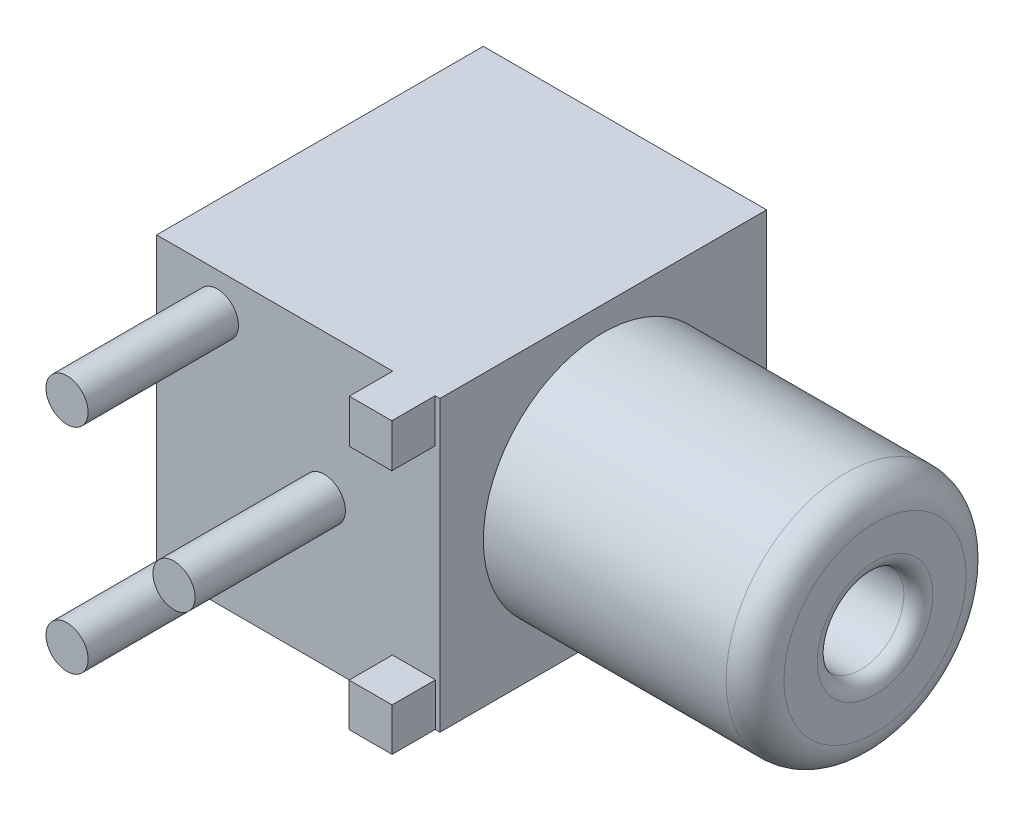
ISO-10303-21;
HEADER;
FILE_DESCRIPTION(('STEP AP214'),'2;1');
FILE_NAME('part.step','',(''),(''),'','','');
FILE_SCHEMA(('AUTOMOTIVE_DESIGN { 1 0 10303 214 1 1 1 1 }'));
ENDSEC;
DATA;
#1=APPLICATION_CONTEXT('core data for automotive mechanical design processes');
#2=APPLICATION_PROTOCOL_DEFINITION('international standard','automotive_design',2000,#1);
#3=PRODUCT_CONTEXT('',#1,'mechanical');
#4=PRODUCT('Part','Part','',(#3));
#5=PRODUCT_RELATED_PRODUCT_CATEGORY('part','',(#4));
#6=PRODUCT_DEFINITION_FORMATION('','',#4);
#7=PRODUCT_DEFINITION_CONTEXT('part definition',#1,'design');
#8=PRODUCT_DEFINITION('design','',#6,#7);
#9=PRODUCT_DEFINITION_SHAPE('','',#8);
#10=(LENGTH_UNIT() NAMED_UNIT(*) SI_UNIT(.MILLI.,.METRE.));
#11=(NAMED_UNIT(*) PLANE_ANGLE_UNIT() SI_UNIT($,.RADIAN.));
#12=(NAMED_UNIT(*) SI_UNIT($,.STERADIAN.) SOLID_ANGLE_UNIT());
#13=UNCERTAINTY_MEASURE_WITH_UNIT(LENGTH_MEASURE(1.E-05),#10,'distance_accuracy_value','');
#14=(GEOMETRIC_REPRESENTATION_CONTEXT(3) GLOBAL_UNCERTAINTY_ASSIGNED_CONTEXT((#13)) GLOBAL_UNIT_ASSIGNED_CONTEXT((#10,
#11,#12)) REPRESENTATION_CONTEXT('',''));
#15=CARTESIAN_POINT('',(0.,0.,0.));
#16=DIRECTION('',(0.,0.,1.));
#17=DIRECTION('',(1.,0.,0.));
#18=AXIS2_PLACEMENT_3D('',#15,#16,#17);
#19=CARTESIAN_POINT('',(0.,0.,0.));
#20=DIRECTION('',(0.,0.,1.));
#21=DIRECTION('',(1.,0.,0.));
#22=AXIS2_PLACEMENT_3D('',#19,#20,#21);
#23=PLANE('',#22);
#24=DIRECTION('',(-1.,0.,0.));
#25=VECTOR('',#24,1.);
#26=CARTESIAN_POINT('',(50.6168428534542,13.0017664427149,0.));
#27=LINE('',#26,#25);
#28=CARTESIAN_POINT('',(52.1031571465458,13.0017664427149,0.));
#29=VERTEX_POINT('',#28);
#30=CARTESIAN_POINT('',(50.6168428534542,13.0017664427149,0.));
#31=VERTEX_POINT('',#30);
#32=EDGE_CURVE('E146',#29,#31,#27,.T.);
#33=ORIENTED_EDGE('',*,*,#32,.F.);
#34=DIRECTION('',(0.,1.,0.));
#35=VECTOR('',#34,1.);
#36=CARTESIAN_POINT('',(52.1031571465458,11.5182335572851,0.));
#37=LINE('',#36,#35);
#38=CARTESIAN_POINT('',(52.1031571465458,11.5182335572851,0.));
#39=VERTEX_POINT('',#38);
#40=EDGE_CURVE('E143',#39,#29,#37,.T.);
#41=ORIENTED_EDGE('',*,*,#40,.F.);
#42=DIRECTION('',(1.,0.,0.));
#43=VECTOR('',#42,1.);
#44=CARTESIAN_POINT('',(50.6168428534542,11.5182335572851,0.));
#45=LINE('',#44,#43);
#46=CARTESIAN_POINT('',(50.6168428534542,11.5182335572851,0.));
#47=VERTEX_POINT('',#46);
#48=EDGE_CURVE('E156',#47,#39,#45,.T.);
#49=ORIENTED_EDGE('',*,*,#48,.F.);
#50=DIRECTION('',(0.,-1.,0.));
#51=VECTOR('',#50,1.);
#52=CARTESIAN_POINT('',(50.6168428534542,11.5182335572851,0.));
#53=LINE('',#52,#51);
#54=EDGE_CURVE('E164',#31,#47,#53,.T.);
#55=ORIENTED_EDGE('',*,*,#54,.F.);
#56=EDGE_LOOP('',(#33,#41,#49,#55));
#57=FACE_BOUND('',#56,.T.);
#58=CARTESIAN_POINT('',(44.56,12.81,0.));
#59=DIRECTION('',(0.,0.,1.));
#60=DIRECTION('',(1.,0.,0.));
#61=AXIS2_PLACEMENT_3D('',#58,#59,#60);
#62=CIRCLE('',#61,0.728999999999994);
#63=CARTESIAN_POINT('',(45.289,12.81,0.));
#64=VERTEX_POINT('',#63);
#65=EDGE_CURVE('E187',#64,#64,#62,.T.);
#66=ORIENTED_EDGE('',*,*,#65,.F.);
#67=EDGE_LOOP('',(#66));
#68=FACE_BOUND('',#67,.T.);
#69=CARTESIAN_POINT('',(44.56,20.21,0.));
#70=DIRECTION('',(0.,0.,1.));
#71=DIRECTION('',(1.,0.,0.));
#72=AXIS2_PLACEMENT_3D('',#69,#70,#71);
#73=CIRCLE('',#72,0.729000000000001);
#74=CARTESIAN_POINT('',(45.289,20.21,0.));
#75=VERTEX_POINT('',#74);
#76=EDGE_CURVE('E223',#75,#75,#73,.T.);
#77=ORIENTED_EDGE('',*,*,#76,.F.);
#78=EDGE_LOOP('',(#77));
#79=FACE_BOUND('',#78,.T.);
#80=CARTESIAN_POINT('',(48.26,16.51,0.));
#81=DIRECTION('',(0.,0.,1.));
#82=DIRECTION('',(1.,0.,0.));
#83=AXIS2_PLACEMENT_3D('',#80,#81,#82);
#84=CIRCLE('',#83,0.728999999999994);
#85=CARTESIAN_POINT('',(48.989,16.51,0.));
#86=VERTEX_POINT('',#85);
#87=EDGE_CURVE('E183',#86,#86,#84,.T.);
#88=ORIENTED_EDGE('',*,*,#87,.F.);
#89=EDGE_LOOP('',(#88));
#90=FACE_BOUND('',#89,.T.);
#91=DIRECTION('',(-1.,0.,0.));
#92=VECTOR('',#91,1.);
#93=CARTESIAN_POINT('',(52.26,21.51,0.));
#94=LINE('',#93,#92);
#95=CARTESIAN_POINT('',(52.26,21.51,0.));
#96=VERTEX_POINT('',#95);
#97=CARTESIAN_POINT('',(52.094846922835,21.51,0.));
#98=VERTEX_POINT('',#97);
#99=EDGE_CURVE('E200',#96,#98,#94,.T.);
#100=ORIENTED_EDGE('',*,*,#99,.T.);
#101=DIRECTION('',(0.,1.,0.));
#102=VECTOR('',#101,1.);
#103=CARTESIAN_POINT('',(52.094846922835,20.01,0.));
#104=LINE('',#103,#102);
#105=CARTESIAN_POINT('',(52.094846922835,20.01,0.));
#106=VERTEX_POINT('',#105);
#107=EDGE_CURVE('E53',#106,#98,#104,.T.);
#108=ORIENTED_EDGE('',*,*,#107,.F.);
#109=DIRECTION('',(1.,0.,0.));
#110=VECTOR('',#109,1.);
#111=CARTESIAN_POINT('',(50.625153077165,20.01,0.));
#112=LINE('',#111,#110);
#113=CARTESIAN_POINT('',(50.625153077165,20.01,0.));
#114=VERTEX_POINT('',#113);
#115=EDGE_CURVE('E48',#114,#106,#112,.T.);
#116=ORIENTED_EDGE('',*,*,#115,.F.);
#117=DIRECTION('',(0.,-1.,0.));
#118=VECTOR('',#117,1.);
#119=CARTESIAN_POINT('',(50.625153077165,20.01,0.));
#120=LINE('',#119,#118);
#121=CARTESIAN_POINT('',(50.625153077165,21.51,0.));
#122=VERTEX_POINT('',#121);
#123=EDGE_CURVE('E308',#122,#114,#120,.T.);
#124=ORIENTED_EDGE('',*,*,#123,.F.);
#125=CARTESIAN_POINT('',(42.46,21.51,0.));
#126=VERTEX_POINT('',#125);
#127=EDGE_CURVE('E218',#122,#126,#94,.T.);
#128=ORIENTED_EDGE('',*,*,#127,.T.);
#129=DIRECTION('',(0.,-1.,0.));
#130=VECTOR('',#129,1.);
#131=CARTESIAN_POINT('',(42.46,21.51,0.));
#132=LINE('',#131,#130);
#133=CARTESIAN_POINT('',(42.46,11.51,0.));
#134=VERTEX_POINT('',#133);
#135=EDGE_CURVE('E193',#126,#134,#132,.T.);
#136=ORIENTED_EDGE('',*,*,#135,.T.);
#137=DIRECTION('',(1.,0.,0.));
#138=VECTOR('',#137,1.);
#139=CARTESIAN_POINT('',(42.46,11.51,0.));
#140=LINE('',#139,#138);
#141=CARTESIAN_POINT('',(52.26,11.51,0.));
#142=VERTEX_POINT('',#141);
#143=EDGE_CURVE('E212',#134,#142,#140,.T.);
#144=ORIENTED_EDGE('',*,*,#143,.T.);
#145=DIRECTION('',(0.,1.,0.));
#146=VECTOR('',#145,1.);
#147=CARTESIAN_POINT('',(52.26,11.51,0.));
#148=LINE('',#147,#146);
#149=EDGE_CURVE('E215',#142,#96,#148,.T.);
#150=ORIENTED_EDGE('',*,*,#149,.T.);
#151=EDGE_LOOP('',(#100,#108,#116,#124,#128,#136,#144,#150));
#152=FACE_BOUND('',#151,.T.);
#153=ADVANCED_FACE('F33',(#57,#68,#79,#90,#152),#23,.T.);
#154=CARTESIAN_POINT('',(52.26,11.51,-11.3));
#155=DIRECTION('',(1.,0.,0.));
#156=DIRECTION('',(0.,0.,-1.));
#157=AXIS2_PLACEMENT_3D('',#154,#155,#156);
#158=PLANE('',#157);
#159=ORIENTED_EDGE('',*,*,#149,.F.);
#160=DIRECTION('',(0.,0.,1.));
#161=VECTOR('',#160,1.);
#162=CARTESIAN_POINT('',(52.26,11.51,-11.3));
#163=LINE('',#162,#161);
#164=CARTESIAN_POINT('',(52.26,11.51,-11.3));
#165=VERTEX_POINT('',#164);
#166=EDGE_CURVE('E226',#165,#142,#163,.T.);
#167=ORIENTED_EDGE('',*,*,#166,.F.);
#168=DIRECTION('',(0.,1.,0.));
#169=VECTOR('',#168,1.);
#170=CARTESIAN_POINT('',(52.26,11.51,-11.3));
#171=LINE('',#170,#169);
#172=CARTESIAN_POINT('',(52.26,21.51,-11.3));
#173=VERTEX_POINT('',#172);
#174=EDGE_CURVE('E203',#165,#173,#171,.T.);
#175=ORIENTED_EDGE('',*,*,#174,.T.);
#176=DIRECTION('',(0.,0.,1.));
#177=VECTOR('',#176,1.);
#178=CARTESIAN_POINT('',(52.26,21.51,-11.3));
#179=LINE('',#178,#177);
#180=EDGE_CURVE('E224',#173,#96,#179,.T.);
#181=ORIENTED_EDGE('',*,*,#180,.T.);
#182=EDGE_LOOP('',(#159,#167,#175,#181));
#183=FACE_BOUND('',#182,.T.);
#184=CARTESIAN_POINT('',(52.26,16.51,-5.65));
#185=DIRECTION('',(1.,0.,0.));
#186=DIRECTION('',(0.,0.,-1.));
#187=AXIS2_PLACEMENT_3D('',#184,#185,#186);
#188=CIRCLE('',#187,4.15);
#189=CARTESIAN_POINT('',(52.26,16.51,-9.8));
#190=VERTEX_POINT('',#189);
#191=EDGE_CURVE('E180',#190,#190,#188,.T.);
#192=ORIENTED_EDGE('',*,*,#191,.F.);
#193=EDGE_LOOP('',(#192));
#194=FACE_BOUND('',#193,.T.);
#195=ADVANCED_FACE('F260',(#183,#194),#158,.T.);
#196=CARTESIAN_POINT('',(44.56,20.21,5.2));
#197=DIRECTION('',(0.,0.,-1.));
#198=DIRECTION('',(-1.,0.,0.));
#199=AXIS2_PLACEMENT_3D('',#196,#197,#198);
#200=CYLINDRICAL_SURFACE('',#199,0.729000000000001);
#201=CARTESIAN_POINT('',(44.56,20.21,5.2));
#202=DIRECTION('',(0.,0.,1.));
#203=DIRECTION('',(1.,0.,0.));
#204=AXIS2_PLACEMENT_3D('',#201,#202,#203);
#205=CIRCLE('',#204,0.729000000000001);
#206=CARTESIAN_POINT('',(45.289,20.21,5.2));
#207=VERTEX_POINT('',#206);
#208=EDGE_CURVE('E231',#207,#207,#205,.T.);
#209=ORIENTED_EDGE('',*,*,#208,.F.);
#210=EDGE_LOOP('',(#209));
#211=FACE_BOUND('',#210,.T.);
#212=ORIENTED_EDGE('',*,*,#76,.T.);
#213=EDGE_LOOP('',(#212));
#214=FACE_BOUND('',#213,.T.);
#215=ADVANCED_FACE('F266',(#211,#214),#200,.T.);
#216=CARTESIAN_POINT('',(44.56,20.21,5.2));
#217=DIRECTION('',(0.,0.,1.));
#218=DIRECTION('',(1.,0.,0.));
#219=AXIS2_PLACEMENT_3D('',#216,#217,#218);
#220=PLANE('',#219);
#221=ORIENTED_EDGE('',*,*,#208,.T.);
#222=EDGE_LOOP('',(#221));
#223=FACE_BOUND('',#222,.T.);
#224=ADVANCED_FACE('F284',(#223),#220,.T.);
#225=CARTESIAN_POINT('',(42.46,21.51,-11.3));
#226=DIRECTION('',(-1.,0.,0.));
#227=DIRECTION('',(0.,-1.,0.));
#228=AXIS2_PLACEMENT_3D('',#225,#226,#227);
#229=PLANE('',#228);
#230=ORIENTED_EDGE('',*,*,#135,.F.);
#231=DIRECTION('',(0.,0.,1.));
#232=VECTOR('',#231,1.);
#233=CARTESIAN_POINT('',(42.46,21.51,-11.3));
#234=LINE('',#233,#232);
#235=CARTESIAN_POINT('',(42.46,21.51,-11.3));
#236=VERTEX_POINT('',#235);
#237=EDGE_CURVE('E220',#236,#126,#234,.T.);
#238=ORIENTED_EDGE('',*,*,#237,.F.);
#239=DIRECTION('',(0.,-1.,0.));
#240=VECTOR('',#239,1.);
#241=CARTESIAN_POINT('',(42.46,21.51,-11.3));
#242=LINE('',#241,#240);
#243=CARTESIAN_POINT('',(42.46,11.51,-11.3));
#244=VERTEX_POINT('',#243);
#245=EDGE_CURVE('E196',#236,#244,#242,.T.);
#246=ORIENTED_EDGE('',*,*,#245,.T.);
#247=DIRECTION('',(0.,0.,1.));
#248=VECTOR('',#247,1.);
#249=CARTESIAN_POINT('',(42.46,11.51,-11.3));
#250=LINE('',#249,#248);
#251=EDGE_CURVE('E209',#244,#134,#250,.T.);
#252=ORIENTED_EDGE('',*,*,#251,.T.);
#253=EDGE_LOOP('',(#230,#238,#246,#252));
#254=FACE_BOUND('',#253,.T.);
#255=ADVANCED_FACE('F277',(#254),#229,.T.);
#256=CARTESIAN_POINT('',(52.26,21.51,-11.3));
#257=DIRECTION('',(0.,1.,0.));
#258=DIRECTION('',(0.,0.,1.));
#259=AXIS2_PLACEMENT_3D('',#256,#257,#258);
#260=PLANE('',#259);
#261=ORIENTED_EDGE('',*,*,#99,.F.);
#262=ORIENTED_EDGE('',*,*,#180,.F.);
#263=DIRECTION('',(-1.,0.,0.));
#264=VECTOR('',#263,1.);
#265=CARTESIAN_POINT('',(52.26,21.51,-11.3));
#266=LINE('',#265,#264);
#267=EDGE_CURVE('E206',#173,#236,#266,.T.);
#268=ORIENTED_EDGE('',*,*,#267,.T.);
#269=ORIENTED_EDGE('',*,*,#237,.T.);
#270=ORIENTED_EDGE('',*,*,#127,.F.);
#271=DIRECTION('',(0.,0.,-1.));
#272=VECTOR('',#271,1.);
#273=CARTESIAN_POINT('',(50.625153077165,21.51,1.5));
#274=LINE('',#273,#272);
#275=CARTESIAN_POINT('',(50.625153077165,21.51,1.5));
#276=VERTEX_POINT('',#275);
#277=EDGE_CURVE('E128',#276,#122,#274,.T.);
#278=ORIENTED_EDGE('',*,*,#277,.F.);
#279=DIRECTION('',(-1.,0.,0.));
#280=VECTOR('',#279,1.);
#281=CARTESIAN_POINT('',(50.625153077165,21.51,1.5));
#282=LINE('',#281,#280);
#283=CARTESIAN_POINT('',(52.094846922835,21.51,1.5));
#284=VERTEX_POINT('',#283);
#285=EDGE_CURVE('E121',#284,#276,#282,.T.);
#286=ORIENTED_EDGE('',*,*,#285,.F.);
#287=DIRECTION('',(0.,0.,-1.));
#288=VECTOR('',#287,1.);
#289=CARTESIAN_POINT('',(52.094846922835,21.51,1.5));
#290=LINE('',#289,#288);
#291=EDGE_CURVE('E126',#284,#98,#290,.T.);
#292=ORIENTED_EDGE('',*,*,#291,.T.);
#293=EDGE_LOOP('',(#261,#262,#268,#269,#270,#278,#286,#292));
#294=FACE_BOUND('',#293,.T.);
#295=ADVANCED_FACE('F124',(#294),#260,.T.);
#296=CARTESIAN_POINT('',(42.46,11.51,-11.3));
#297=DIRECTION('',(0.,-1.,0.));
#298=DIRECTION('',(0.,0.,-1.));
#299=AXIS2_PLACEMENT_3D('',#296,#297,#298);
#300=PLANE('',#299);
#301=ORIENTED_EDGE('',*,*,#143,.F.);
#302=ORIENTED_EDGE('',*,*,#251,.F.);
#303=DIRECTION('',(1.,0.,0.));
#304=VECTOR('',#303,1.);
#305=CARTESIAN_POINT('',(42.46,11.51,-11.3));
#306=LINE('',#305,#304);
#307=EDGE_CURVE('E199',#244,#165,#306,.T.);
#308=ORIENTED_EDGE('',*,*,#307,.T.);
#309=ORIENTED_EDGE('',*,*,#166,.T.);
#310=EDGE_LOOP('',(#301,#302,#308,#309));
#311=FACE_BOUND('',#310,.T.);
#312=ADVANCED_FACE('F276',(#311),#300,.T.);
#313=CARTESIAN_POINT('',(0.,0.,-11.3));
#314=DIRECTION('',(0.,0.,1.));
#315=DIRECTION('',(1.,0.,0.));
#316=AXIS2_PLACEMENT_3D('',#313,#314,#315);
#317=PLANE('',#316);
#318=ORIENTED_EDGE('',*,*,#245,.F.);
#319=ORIENTED_EDGE('',*,*,#267,.F.);
#320=ORIENTED_EDGE('',*,*,#174,.F.);
#321=ORIENTED_EDGE('',*,*,#307,.F.);
#322=EDGE_LOOP('',(#318,#319,#320,#321));
#323=FACE_BOUND('',#322,.T.);
#324=ADVANCED_FACE('F273',(#323),#317,.F.);
#325=CARTESIAN_POINT('',(44.56,12.81,5.2));
#326=DIRECTION('',(0.,0.,-1.));
#327=DIRECTION('',(-1.,0.,0.));
#328=AXIS2_PLACEMENT_3D('',#325,#326,#327);
#329=CYLINDRICAL_SURFACE('',#328,0.728999999999994);
#330=CARTESIAN_POINT('',(44.56,12.81,5.2));
#331=DIRECTION('',(0.,0.,1.));
#332=DIRECTION('',(1.,0.,0.));
#333=AXIS2_PLACEMENT_3D('',#330,#331,#332);
#334=CIRCLE('',#333,0.728999999999994);
#335=CARTESIAN_POINT('',(45.289,12.81,5.2));
#336=VERTEX_POINT('',#335);
#337=EDGE_CURVE('E190',#336,#336,#334,.T.);
#338=ORIENTED_EDGE('',*,*,#337,.F.);
#339=EDGE_LOOP('',(#338));
#340=FACE_BOUND('',#339,.T.);
#341=ORIENTED_EDGE('',*,*,#65,.T.);
#342=EDGE_LOOP('',(#341));
#343=FACE_BOUND('',#342,.T.);
#344=ADVANCED_FACE('F371',(#340,#343),#329,.T.);
#345=CARTESIAN_POINT('',(44.56,12.81,5.2));
#346=DIRECTION('',(0.,0.,1.));
#347=DIRECTION('',(1.,0.,0.));
#348=AXIS2_PLACEMENT_3D('',#345,#346,#347);
#349=PLANE('',#348);
#350=ORIENTED_EDGE('',*,*,#337,.T.);
#351=EDGE_LOOP('',(#350));
#352=FACE_BOUND('',#351,.T.);
#353=ADVANCED_FACE('F368',(#352),#349,.T.);
#354=CARTESIAN_POINT('',(48.26,16.51,5.2));
#355=DIRECTION('',(0.,0.,-1.));
#356=DIRECTION('',(-1.,0.,0.));
#357=AXIS2_PLACEMENT_3D('',#354,#355,#356);
#358=CYLINDRICAL_SURFACE('',#357,0.728999999999994);
#359=CARTESIAN_POINT('',(48.26,16.51,5.2));
#360=DIRECTION('',(0.,0.,1.));
#361=DIRECTION('',(1.,0.,0.));
#362=AXIS2_PLACEMENT_3D('',#359,#360,#361);
#363=CIRCLE('',#362,0.728999999999994);
#364=CARTESIAN_POINT('',(48.989,16.51,5.2));
#365=VERTEX_POINT('',#364);
#366=EDGE_CURVE('E184',#365,#365,#363,.T.);
#367=ORIENTED_EDGE('',*,*,#366,.F.);
#368=EDGE_LOOP('',(#367));
#369=FACE_BOUND('',#368,.T.);
#370=ORIENTED_EDGE('',*,*,#87,.T.);
#371=EDGE_LOOP('',(#370));
#372=FACE_BOUND('',#371,.T.);
#373=ADVANCED_FACE('F364',(#369,#372),#358,.T.);
#374=CARTESIAN_POINT('',(48.26,16.51,5.2));
#375=DIRECTION('',(0.,0.,1.));
#376=DIRECTION('',(1.,0.,0.));
#377=AXIS2_PLACEMENT_3D('',#374,#375,#376);
#378=PLANE('',#377);
#379=ORIENTED_EDGE('',*,*,#366,.T.);
#380=EDGE_LOOP('',(#379));
#381=FACE_BOUND('',#380,.T.);
#382=ADVANCED_FACE('F360',(#381),#378,.T.);
#383=CARTESIAN_POINT('',(61.66,16.51,-5.65));
#384=DIRECTION('',(-1.,0.,0.));
#385=DIRECTION('',(0.,0.,1.));
#386=AXIS2_PLACEMENT_3D('',#383,#384,#385);
#387=CYLINDRICAL_SURFACE('',#386,4.15);
#388=CARTESIAN_POINT('',(60.66,16.51,-5.65));
#389=DIRECTION('',(1.,0.,0.));
#390=DIRECTION('',(0.,0.,-1.));
#391=AXIS2_PLACEMENT_3D('',#388,#389,#390);
#392=CIRCLE('',#391,4.15);
#393=CARTESIAN_POINT('',(60.66,16.51,-9.8));
#394=VERTEX_POINT('',#393);
#395=EDGE_CURVE('E237',#394,#394,#392,.F.);
#396=ORIENTED_EDGE('',*,*,#395,.T.);
#397=EDGE_LOOP('',(#396));
#398=FACE_BOUND('',#397,.T.);
#399=ORIENTED_EDGE('',*,*,#191,.T.);
#400=EDGE_LOOP('',(#399));
#401=FACE_BOUND('',#400,.T.);
#402=ADVANCED_FACE('F356',(#398,#401),#387,.T.);
#403=CARTESIAN_POINT('',(61.66,16.51,-5.65));
#404=DIRECTION('',(1.,0.,0.));
#405=DIRECTION('',(0.,0.,-1.));
#406=AXIS2_PLACEMENT_3D('',#403,#404,#405);
#407=PLANE('',#406);
#408=CARTESIAN_POINT('',(61.66,16.51,-5.65));
#409=DIRECTION('',(1.,0.,0.));
#410=DIRECTION('',(0.,0.,-1.));
#411=AXIS2_PLACEMENT_3D('',#408,#409,#410);
#412=CIRCLE('',#411,2.);
#413=CARTESIAN_POINT('',(61.66,16.51,-7.65));
#414=VERTEX_POINT('',#413);
#415=EDGE_CURVE('E11',#414,#414,#412,.F.);
#416=ORIENTED_EDGE('',*,*,#415,.T.);
#417=EDGE_LOOP('',(#416));
#418=FACE_BOUND('',#417,.T.);
#419=CARTESIAN_POINT('',(61.66,16.51,-5.65));
#420=DIRECTION('',(1.,0.,0.));
#421=DIRECTION('',(0.,0.,-1.));
#422=AXIS2_PLACEMENT_3D('',#419,#420,#421);
#423=CIRCLE('',#422,3.15);
#424=CARTESIAN_POINT('',(61.66,16.51,-8.8));
#425=VERTEX_POINT('',#424);
#426=EDGE_CURVE('E234',#425,#425,#423,.T.);
#427=ORIENTED_EDGE('',*,*,#426,.T.);
#428=EDGE_LOOP('',(#427));
#429=FACE_BOUND('',#428,.T.);
#430=ADVANCED_FACE('F353',(#418,#429),#407,.T.);
#431=CARTESIAN_POINT('',(52.26,16.51,-5.65));
#432=DIRECTION('',(1.,0.,0.));
#433=DIRECTION('',(0.,0.,-1.));
#434=AXIS2_PLACEMENT_3D('',#431,#432,#433);
#435=CYLINDRICAL_SURFACE('',#434,1.5);
#436=CARTESIAN_POINT('',(61.16,16.51,-5.65));
#437=DIRECTION('',(1.,0.,0.));
#438=DIRECTION('',(0.,0.,-1.));
#439=AXIS2_PLACEMENT_3D('',#436,#437,#438);
#440=CIRCLE('',#439,1.5);
#441=CARTESIAN_POINT('',(61.16,16.51,-7.15));
#442=VERTEX_POINT('',#441);
#443=EDGE_CURVE('E41',#442,#442,#440,.T.);
#444=ORIENTED_EDGE('',*,*,#443,.T.);
#445=EDGE_LOOP('',(#444));
#446=FACE_BOUND('',#445,.T.);
#447=CARTESIAN_POINT('',(52.26,16.51,-5.65));
#448=DIRECTION('',(1.,0.,0.));
#449=DIRECTION('',(0.,0.,-1.));
#450=AXIS2_PLACEMENT_3D('',#447,#448,#449);
#451=CIRCLE('',#450,1.5);
#452=CARTESIAN_POINT('',(52.26,16.51,-7.15));
#453=VERTEX_POINT('',#452);
#454=EDGE_CURVE('E177',#453,#453,#451,.T.);
#455=ORIENTED_EDGE('',*,*,#454,.F.);
#456=EDGE_LOOP('',(#455));
#457=FACE_BOUND('',#456,.T.);
#458=ADVANCED_FACE('F242',(#446,#457),#435,.F.);
#459=CARTESIAN_POINT('',(52.26,16.51,-5.65));
#460=DIRECTION('',(1.,0.,0.));
#461=DIRECTION('',(0.,0.,-1.));
#462=AXIS2_PLACEMENT_3D('',#459,#460,#461);
#463=PLANE('',#462);
#464=ORIENTED_EDGE('',*,*,#454,.T.);
#465=EDGE_LOOP('',(#464));
#466=FACE_BOUND('',#465,.T.);
#467=ADVANCED_FACE('F256',(#466),#463,.T.);
#468=CARTESIAN_POINT('',(60.66,16.51,-5.65));
#469=DIRECTION('',(1.,0.,0.));
#470=DIRECTION('',(0.,0.,-1.));
#471=AXIS2_PLACEMENT_3D('',#468,#469,#470);
#472=TOROIDAL_SURFACE('',#471,3.15,1.);
#473=ORIENTED_EDGE('',*,*,#395,.F.);
#474=EDGE_LOOP('',(#473));
#475=FACE_BOUND('',#474,.T.);
#476=ORIENTED_EDGE('',*,*,#426,.F.);
#477=EDGE_LOOP('',(#476));
#478=FACE_BOUND('',#477,.T.);
#479=ADVANCED_FACE('F247',(#475,#478),#472,.T.);
#480=CARTESIAN_POINT('',(61.16,16.51,-5.65));
#481=DIRECTION('',(1.,0.,0.));
#482=DIRECTION('',(0.,0.,-1.));
#483=AXIS2_PLACEMENT_3D('',#480,#481,#482);
#484=TOROIDAL_SURFACE('',#483,2.,0.5);
#485=ORIENTED_EDGE('',*,*,#415,.F.);
#486=EDGE_LOOP('',(#485));
#487=FACE_BOUND('',#486,.T.);
#488=ORIENTED_EDGE('',*,*,#443,.F.);
#489=EDGE_LOOP('',(#488));
#490=FACE_BOUND('',#489,.T.);
#491=ADVANCED_FACE('F35',(#487,#490),#484,.T.);
#492=CARTESIAN_POINT('',(52.1031571465458,11.5182335572851,1.5));
#493=DIRECTION('',(-1.,0.,0.));
#494=DIRECTION('',(0.,0.,1.));
#495=AXIS2_PLACEMENT_3D('',#492,#493,#494);
#496=PLANE('',#495);
#497=ORIENTED_EDGE('',*,*,#40,.T.);
#498=DIRECTION('',(0.,0.,-1.));
#499=VECTOR('',#498,1.);
#500=CARTESIAN_POINT('',(52.1031571465458,13.0017664427149,1.5));
#501=LINE('',#500,#499);
#502=CARTESIAN_POINT('',(52.1031571465458,13.0017664427149,1.5));
#503=VERTEX_POINT('',#502);
#504=EDGE_CURVE('E175',#503,#29,#501,.T.);
#505=ORIENTED_EDGE('',*,*,#504,.F.);
#506=DIRECTION('',(0.,1.,0.));
#507=VECTOR('',#506,1.);
#508=CARTESIAN_POINT('',(52.1031571465458,11.5182335572851,1.5));
#509=LINE('',#508,#507);
#510=CARTESIAN_POINT('',(52.1031571465458,11.5182335572851,1.5));
#511=VERTEX_POINT('',#510);
#512=EDGE_CURVE('E152',#511,#503,#509,.T.);
#513=ORIENTED_EDGE('',*,*,#512,.F.);
#514=DIRECTION('',(0.,0.,-1.));
#515=VECTOR('',#514,1.);
#516=CARTESIAN_POINT('',(52.1031571465458,11.5182335572851,1.5));
#517=LINE('',#516,#515);
#518=EDGE_CURVE('E161',#511,#39,#517,.T.);
#519=ORIENTED_EDGE('',*,*,#518,.T.);
#520=EDGE_LOOP('',(#497,#505,#513,#519));
#521=FACE_BOUND('',#520,.T.);
#522=ADVANCED_FACE('F246',(#521),#496,.F.);
#523=CARTESIAN_POINT('',(50.6168428534542,13.0017664427149,1.5));
#524=DIRECTION('',(0.,-1.,0.));
#525=DIRECTION('',(0.,0.,-1.));
#526=AXIS2_PLACEMENT_3D('',#523,#524,#525);
#527=PLANE('',#526);
#528=ORIENTED_EDGE('',*,*,#32,.T.);
#529=DIRECTION('',(0.,0.,-1.));
#530=VECTOR('',#529,1.);
#531=CARTESIAN_POINT('',(50.6168428534542,13.0017664427149,1.5));
#532=LINE('',#531,#530);
#533=CARTESIAN_POINT('',(50.6168428534542,13.0017664427149,1.5));
#534=VERTEX_POINT('',#533);
#535=EDGE_CURVE('E172',#534,#31,#532,.T.);
#536=ORIENTED_EDGE('',*,*,#535,.F.);
#537=DIRECTION('',(-1.,0.,0.));
#538=VECTOR('',#537,1.);
#539=CARTESIAN_POINT('',(50.6168428534542,13.0017664427149,1.5));
#540=LINE('',#539,#538);
#541=EDGE_CURVE('E155',#503,#534,#540,.T.);
#542=ORIENTED_EDGE('',*,*,#541,.F.);
#543=ORIENTED_EDGE('',*,*,#504,.T.);
#544=EDGE_LOOP('',(#528,#536,#542,#543));
#545=FACE_BOUND('',#544,.T.);
#546=ADVANCED_FACE('F253',(#545),#527,.F.);
#547=CARTESIAN_POINT('',(50.6168428534542,11.5182335572851,1.5));
#548=DIRECTION('',(1.,0.,0.));
#549=DIRECTION('',(0.,0.,-1.));
#550=AXIS2_PLACEMENT_3D('',#547,#548,#549);
#551=PLANE('',#550);
#552=ORIENTED_EDGE('',*,*,#54,.T.);
#553=DIRECTION('',(0.,0.,-1.));
#554=VECTOR('',#553,1.);
#555=CARTESIAN_POINT('',(50.6168428534542,11.5182335572851,1.5));
#556=LINE('',#555,#554);
#557=CARTESIAN_POINT('',(50.6168428534542,11.5182335572851,1.5));
#558=VERTEX_POINT('',#557);
#559=EDGE_CURVE('E170',#558,#47,#556,.T.);
#560=ORIENTED_EDGE('',*,*,#559,.F.);
#561=DIRECTION('',(0.,-1.,0.));
#562=VECTOR('',#561,1.);
#563=CARTESIAN_POINT('',(50.6168428534542,11.5182335572851,1.5));
#564=LINE('',#563,#562);
#565=EDGE_CURVE('E158',#534,#558,#564,.T.);
#566=ORIENTED_EDGE('',*,*,#565,.F.);
#567=ORIENTED_EDGE('',*,*,#535,.T.);
#568=EDGE_LOOP('',(#552,#560,#566,#567));
#569=FACE_BOUND('',#568,.T.);
#570=ADVANCED_FACE('F340',(#569),#551,.F.);
#571=CARTESIAN_POINT('',(50.6168428534542,11.5182335572851,1.5));
#572=DIRECTION('',(0.,1.,0.));
#573=DIRECTION('',(0.,0.,1.));
#574=AXIS2_PLACEMENT_3D('',#571,#572,#573);
#575=PLANE('',#574);
#576=ORIENTED_EDGE('',*,*,#48,.T.);
#577=ORIENTED_EDGE('',*,*,#518,.F.);
#578=DIRECTION('',(1.,0.,0.));
#579=VECTOR('',#578,1.);
#580=CARTESIAN_POINT('',(50.6168428534542,11.5182335572851,1.5));
#581=LINE('',#580,#579);
#582=EDGE_CURVE('E160',#558,#511,#581,.T.);
#583=ORIENTED_EDGE('',*,*,#582,.F.);
#584=ORIENTED_EDGE('',*,*,#559,.T.);
#585=EDGE_LOOP('',(#576,#577,#583,#584));
#586=FACE_BOUND('',#585,.T.);
#587=ADVANCED_FACE('F336',(#586),#575,.F.);
#588=CARTESIAN_POINT('',(0.,0.,1.5));
#589=DIRECTION('',(0.,0.,-1.));
#590=DIRECTION('',(-1.,0.,0.));
#591=AXIS2_PLACEMENT_3D('',#588,#589,#590);
#592=PLANE('',#591);
#593=ORIENTED_EDGE('',*,*,#512,.T.);
#594=ORIENTED_EDGE('',*,*,#541,.T.);
#595=ORIENTED_EDGE('',*,*,#565,.T.);
#596=ORIENTED_EDGE('',*,*,#582,.T.);
#597=EDGE_LOOP('',(#593,#594,#595,#596));
#598=FACE_BOUND('',#597,.T.);
#599=ADVANCED_FACE('F333',(#598),#592,.F.);
#600=CARTESIAN_POINT('',(52.094846922835,20.01,1.5));
#601=DIRECTION('',(-1.,0.,0.));
#602=DIRECTION('',(0.,0.,1.));
#603=AXIS2_PLACEMENT_3D('',#600,#601,#602);
#604=PLANE('',#603);
#605=ORIENTED_EDGE('',*,*,#107,.T.);
#606=ORIENTED_EDGE('',*,*,#291,.F.);
#607=DIRECTION('',(0.,1.,0.));
#608=VECTOR('',#607,1.);
#609=CARTESIAN_POINT('',(52.094846922835,20.01,1.5));
#610=LINE('',#609,#608);
#611=CARTESIAN_POINT('',(52.094846922835,20.01,1.5));
#612=VERTEX_POINT('',#611);
#613=EDGE_CURVE('E132',#612,#284,#610,.T.);
#614=ORIENTED_EDGE('',*,*,#613,.F.);
#615=DIRECTION('',(0.,0.,-1.));
#616=VECTOR('',#615,1.);
#617=CARTESIAN_POINT('',(52.094846922835,20.01,1.5));
#618=LINE('',#617,#616);
#619=EDGE_CURVE('E315',#612,#106,#618,.T.);
#620=ORIENTED_EDGE('',*,*,#619,.T.);
#621=EDGE_LOOP('',(#605,#606,#614,#620));
#622=FACE_BOUND('',#621,.T.);
#623=ADVANCED_FACE('F142',(#622),#604,.F.);
#624=CARTESIAN_POINT('',(50.625153077165,20.01,1.5));
#625=DIRECTION('',(1.,0.,0.));
#626=DIRECTION('',(0.,0.,-1.));
#627=AXIS2_PLACEMENT_3D('',#624,#625,#626);
#628=PLANE('',#627);
#629=ORIENTED_EDGE('',*,*,#123,.T.);
#630=DIRECTION('',(0.,0.,-1.));
#631=VECTOR('',#630,1.);
#632=CARTESIAN_POINT('',(50.625153077165,20.01,1.5));
#633=LINE('',#632,#631);
#634=CARTESIAN_POINT('',(50.625153077165,20.01,1.5));
#635=VERTEX_POINT('',#634);
#636=EDGE_CURVE('E148',#635,#114,#633,.T.);
#637=ORIENTED_EDGE('',*,*,#636,.F.);
#638=DIRECTION('',(0.,-1.,0.));
#639=VECTOR('',#638,1.);
#640=CARTESIAN_POINT('',(50.625153077165,20.01,1.5));
#641=LINE('',#640,#639);
#642=EDGE_CURVE('E131',#276,#635,#641,.T.);
#643=ORIENTED_EDGE('',*,*,#642,.F.);
#644=ORIENTED_EDGE('',*,*,#277,.T.);
#645=EDGE_LOOP('',(#629,#637,#643,#644));
#646=FACE_BOUND('',#645,.T.);
#647=ADVANCED_FACE('F313',(#646),#628,.F.);
#648=CARTESIAN_POINT('',(50.625153077165,20.01,1.5));
#649=DIRECTION('',(0.,1.,0.));
#650=DIRECTION('',(0.,0.,1.));
#651=AXIS2_PLACEMENT_3D('',#648,#649,#650);
#652=PLANE('',#651);
#653=ORIENTED_EDGE('',*,*,#115,.T.);
#654=ORIENTED_EDGE('',*,*,#619,.F.);
#655=DIRECTION('',(1.,0.,0.));
#656=VECTOR('',#655,1.);
#657=CARTESIAN_POINT('',(50.625153077165,20.01,1.5));
#658=LINE('',#657,#656);
#659=EDGE_CURVE('E137',#635,#612,#658,.T.);
#660=ORIENTED_EDGE('',*,*,#659,.F.);
#661=ORIENTED_EDGE('',*,*,#636,.T.);
#662=EDGE_LOOP('',(#653,#654,#660,#661));
#663=FACE_BOUND('',#662,.T.);
#664=ADVANCED_FACE('F321',(#663),#652,.F.);
#665=CARTESIAN_POINT('',(0.,0.,1.5));
#666=DIRECTION('',(0.,0.,-1.));
#667=DIRECTION('',(-1.,0.,0.));
#668=AXIS2_PLACEMENT_3D('',#665,#666,#667);
#669=PLANE('',#668);
#670=ORIENTED_EDGE('',*,*,#613,.T.);
#671=ORIENTED_EDGE('',*,*,#285,.T.);
#672=ORIENTED_EDGE('',*,*,#642,.T.);
#673=ORIENTED_EDGE('',*,*,#659,.T.);
#674=EDGE_LOOP('',(#670,#671,#672,#673));
#675=FACE_BOUND('',#674,.T.);
#676=ADVANCED_FACE('F135',(#675),#669,.F.);
#677=CLOSED_SHELL('',(#153,#195,#215,#224,#255,#295,#312,#324,#344,#353,#373,#382,#402,#430,
#458,#467,#479,#491,#522,#546,#570,#587,#599,#623,#647,#664,#676));
#678=MANIFOLD_SOLID_BREP('B2',#677);
#679=ADVANCED_BREP_SHAPE_REPRESENTATION('',(#18,#678),#14);
#680=SHAPE_DEFINITION_REPRESENTATION(#9,#679);
ENDSEC;
END-ISO-10303-21;
